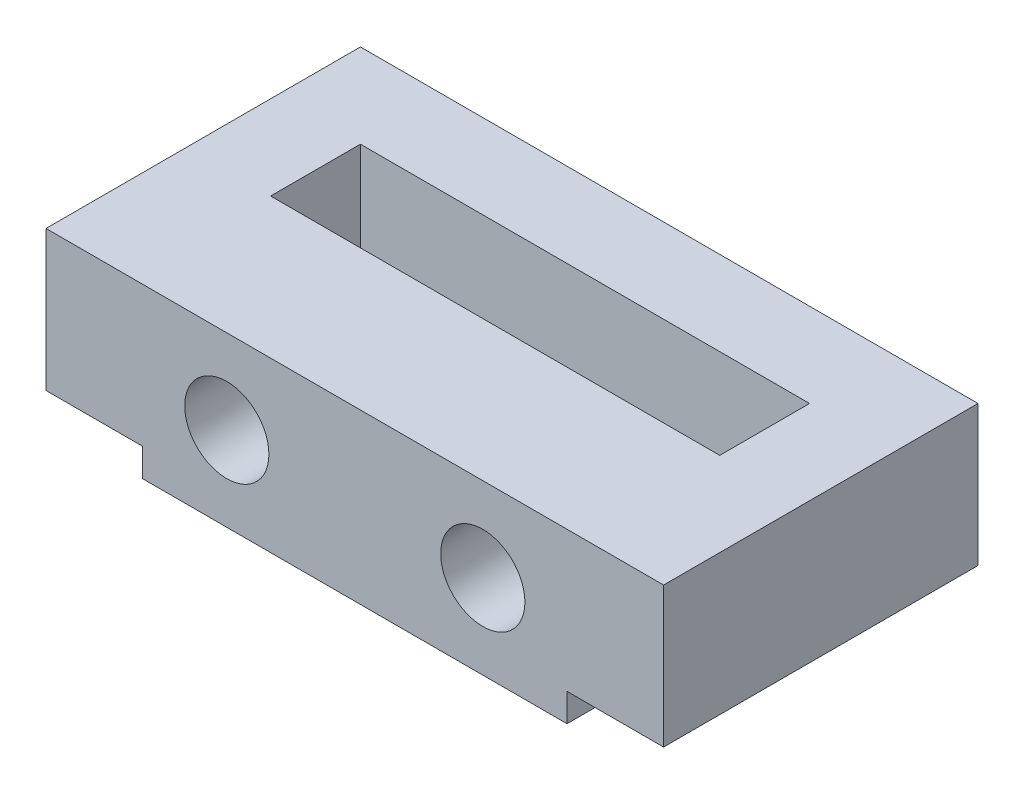
ISO-10303-21;
HEADER;
FILE_DESCRIPTION(('STEP AP214'),'2;1');
FILE_NAME('part.step','',(''),(''),'','','');
FILE_SCHEMA(('AUTOMOTIVE_DESIGN { 1 0 10303 214 1 1 1 1 }'));
ENDSEC;
DATA;
#1=APPLICATION_CONTEXT('core data for automotive mechanical design processes');
#2=APPLICATION_PROTOCOL_DEFINITION('international standard','automotive_design',2000,#1);
#3=PRODUCT_CONTEXT('',#1,'mechanical');
#4=PRODUCT('Part','Part','',(#3));
#5=PRODUCT_RELATED_PRODUCT_CATEGORY('part','',(#4));
#6=PRODUCT_DEFINITION_FORMATION('','',#4);
#7=PRODUCT_DEFINITION_CONTEXT('part definition',#1,'design');
#8=PRODUCT_DEFINITION('design','',#6,#7);
#9=PRODUCT_DEFINITION_SHAPE('','',#8);
#10=(LENGTH_UNIT() NAMED_UNIT(*) SI_UNIT(.MILLI.,.METRE.));
#11=(NAMED_UNIT(*) PLANE_ANGLE_UNIT() SI_UNIT($,.RADIAN.));
#12=(NAMED_UNIT(*) SI_UNIT($,.STERADIAN.) SOLID_ANGLE_UNIT());
#13=UNCERTAINTY_MEASURE_WITH_UNIT(LENGTH_MEASURE(1.E-05),#10,'distance_accuracy_value','');
#14=(GEOMETRIC_REPRESENTATION_CONTEXT(3) GLOBAL_UNCERTAINTY_ASSIGNED_CONTEXT((#13)) GLOBAL_UNIT_ASSIGNED_CONTEXT((#10,
#11,#12)) REPRESENTATION_CONTEXT('',''));
#15=CARTESIAN_POINT('',(0.,0.,0.));
#16=DIRECTION('',(0.,0.,1.));
#17=DIRECTION('',(1.,0.,0.));
#18=AXIS2_PLACEMENT_3D('',#15,#16,#17);
#19=CARTESIAN_POINT('',(0.,0.,5.));
#20=DIRECTION('',(0.,0.,1.));
#21=DIRECTION('',(1.,0.,0.));
#22=AXIS2_PLACEMENT_3D('',#19,#20,#21);
#23=PLANE('',#22);
#24=CARTESIAN_POINT('',(0.,0.,5.));
#25=DIRECTION('',(0.,0.,1.));
#26=DIRECTION('',(1.,0.,0.));
#27=AXIS2_PLACEMENT_3D('',#24,#25,#26);
#28=CIRCLE('',#27,1.5);
#29=CARTESIAN_POINT('',(1.5,0.,5.));
#30=VERTEX_POINT('',#29);
#31=EDGE_CURVE('E156',#30,#30,#28,.T.);
#32=ORIENTED_EDGE('',*,*,#31,.F.);
#33=EDGE_LOOP('',(#32));
#34=FACE_BOUND('',#33,.T.);
#35=DIRECTION('',(-1.,0.,0.));
#36=VECTOR('',#35,1.);
#37=CARTESIAN_POINT('',(-3.,3.,5.));
#38=LINE('',#37,#36);
#39=CARTESIAN_POINT('',(15.56,3.,5.));
#40=VERTEX_POINT('',#39);
#41=CARTESIAN_POINT('',(-6.44,3.,5.));
#42=VERTEX_POINT('',#41);
#43=EDGE_CURVE('E147',#40,#42,#38,.T.);
#44=ORIENTED_EDGE('',*,*,#43,.T.);
#45=DIRECTION('',(0.,1.,0.));
#46=VECTOR('',#45,1.);
#47=CARTESIAN_POINT('',(-6.44,-2.,5.));
#48=LINE('',#47,#46);
#49=CARTESIAN_POINT('',(-6.44,-2.,5.));
#50=VERTEX_POINT('',#49);
#51=EDGE_CURVE('E205',#50,#42,#48,.T.);
#52=ORIENTED_EDGE('',*,*,#51,.F.);
#53=DIRECTION('',(1.,0.,0.));
#54=VECTOR('',#53,1.);
#55=CARTESIAN_POINT('',(-6.44,-2.,5.));
#56=LINE('',#55,#54);
#57=CARTESIAN_POINT('',(-3.,-2.,5.));
#58=VERTEX_POINT('',#57);
#59=EDGE_CURVE('E222',#50,#58,#56,.T.);
#60=ORIENTED_EDGE('',*,*,#59,.T.);
#61=DIRECTION('',(0.,-1.,0.));
#62=VECTOR('',#61,1.);
#63=CARTESIAN_POINT('',(-3.,3.,5.));
#64=LINE('',#63,#62);
#65=CARTESIAN_POINT('',(-3.,-3.,5.));
#66=VERTEX_POINT('',#65);
#67=EDGE_CURVE('E48',#58,#66,#64,.T.);
#68=ORIENTED_EDGE('',*,*,#67,.T.);
#69=DIRECTION('',(1.,0.,0.));
#70=VECTOR('',#69,1.);
#71=CARTESIAN_POINT('',(-3.,-3.,5.));
#72=LINE('',#71,#70);
#73=CARTESIAN_POINT('',(12.12,-3.,5.));
#74=VERTEX_POINT('',#73);
#75=EDGE_CURVE('E145',#66,#74,#72,.T.);
#76=ORIENTED_EDGE('',*,*,#75,.T.);
#77=DIRECTION('',(0.,1.,0.));
#78=VECTOR('',#77,1.);
#79=CARTESIAN_POINT('',(12.12,3.,5.));
#80=LINE('',#79,#78);
#81=CARTESIAN_POINT('',(12.12,-2.,5.));
#82=VERTEX_POINT('',#81);
#83=EDGE_CURVE('E138',#74,#82,#80,.T.);
#84=ORIENTED_EDGE('',*,*,#83,.T.);
#85=DIRECTION('',(1.,0.,0.));
#86=VECTOR('',#85,1.);
#87=CARTESIAN_POINT('',(12.12,-2.,5.));
#88=LINE('',#87,#86);
#89=CARTESIAN_POINT('',(15.56,-2.,5.));
#90=VERTEX_POINT('',#89);
#91=EDGE_CURVE('E120',#82,#90,#88,.T.);
#92=ORIENTED_EDGE('',*,*,#91,.T.);
#93=DIRECTION('',(0.,1.,0.));
#94=VECTOR('',#93,1.);
#95=CARTESIAN_POINT('',(15.56,-2.,5.));
#96=LINE('',#95,#94);
#97=EDGE_CURVE('E170',#90,#40,#96,.T.);
#98=ORIENTED_EDGE('',*,*,#97,.T.);
#99=EDGE_LOOP('',(#44,#52,#60,#68,#76,#84,#92,#98));
#100=FACE_BOUND('',#99,.T.);
#101=CARTESIAN_POINT('',(9.12,0.,5.));
#102=DIRECTION('',(0.,0.,1.));
#103=DIRECTION('',(1.,0.,0.));
#104=AXIS2_PLACEMENT_3D('',#101,#102,#103);
#105=CIRCLE('',#104,1.5);
#106=CARTESIAN_POINT('',(10.62,0.,5.));
#107=VERTEX_POINT('',#106);
#108=EDGE_CURVE('E211',#107,#107,#105,.T.);
#109=ORIENTED_EDGE('',*,*,#108,.F.);
#110=EDGE_LOOP('',(#109));
#111=FACE_BOUND('',#110,.T.);
#112=ADVANCED_FACE('F33',(#34,#100,#111),#23,.T.);
#113=CARTESIAN_POINT('',(0.,0.,0.));
#114=DIRECTION('',(0.,0.,1.));
#115=DIRECTION('',(1.,0.,0.));
#116=AXIS2_PLACEMENT_3D('',#113,#114,#115);
#117=PLANE('',#116);
#118=DIRECTION('',(0.,-1.,0.));
#119=VECTOR('',#118,1.);
#120=CARTESIAN_POINT('',(-3.,3.,0.));
#121=LINE('',#120,#119);
#122=CARTESIAN_POINT('',(-3.,-2.,0.));
#123=VERTEX_POINT('',#122);
#124=CARTESIAN_POINT('',(-3.,-3.,0.));
#125=VERTEX_POINT('',#124);
#126=EDGE_CURVE('E153',#123,#125,#121,.T.);
#127=ORIENTED_EDGE('',*,*,#126,.F.);
#128=DIRECTION('',(-1.,0.,0.));
#129=VECTOR('',#128,1.);
#130=CARTESIAN_POINT('',(-3.44,-2.,0.));
#131=LINE('',#130,#129);
#132=CARTESIAN_POINT('',(-3.44,-2.,0.));
#133=VERTEX_POINT('',#132);
#134=EDGE_CURVE('E226',#123,#133,#131,.T.);
#135=ORIENTED_EDGE('',*,*,#134,.T.);
#136=DIRECTION('',(0.,1.,0.));
#137=VECTOR('',#136,1.);
#138=CARTESIAN_POINT('',(-3.44,-2.,0.));
#139=LINE('',#138,#137);
#140=CARTESIAN_POINT('',(-3.44,3.,0.));
#141=VERTEX_POINT('',#140);
#142=EDGE_CURVE('E202',#133,#141,#139,.T.);
#143=ORIENTED_EDGE('',*,*,#142,.T.);
#144=DIRECTION('',(-1.,0.,0.));
#145=VECTOR('',#144,1.);
#146=CARTESIAN_POINT('',(-3.,3.,0.));
#147=LINE('',#146,#145);
#148=CARTESIAN_POINT('',(12.56,3.,0.));
#149=VERTEX_POINT('',#148);
#150=EDGE_CURVE('E159',#149,#141,#147,.T.);
#151=ORIENTED_EDGE('',*,*,#150,.F.);
#152=DIRECTION('',(0.,1.,0.));
#153=VECTOR('',#152,1.);
#154=CARTESIAN_POINT('',(12.56,-2.,0.));
#155=LINE('',#154,#153);
#156=CARTESIAN_POINT('',(12.56,-2.,0.));
#157=VERTEX_POINT('',#156);
#158=EDGE_CURVE('E167',#157,#149,#155,.T.);
#159=ORIENTED_EDGE('',*,*,#158,.F.);
#160=DIRECTION('',(-1.,0.,0.));
#161=VECTOR('',#160,1.);
#162=CARTESIAN_POINT('',(12.12,-2.,0.));
#163=LINE('',#162,#161);
#164=CARTESIAN_POINT('',(12.12,-2.,0.));
#165=VERTEX_POINT('',#164);
#166=EDGE_CURVE('E165',#157,#165,#163,.T.);
#167=ORIENTED_EDGE('',*,*,#166,.T.);
#168=DIRECTION('',(0.,1.,0.));
#169=VECTOR('',#168,1.);
#170=CARTESIAN_POINT('',(12.12,3.,0.));
#171=LINE('',#170,#169);
#172=CARTESIAN_POINT('',(12.12,-3.,0.));
#173=VERTEX_POINT('',#172);
#174=EDGE_CURVE('E140',#173,#165,#171,.T.);
#175=ORIENTED_EDGE('',*,*,#174,.F.);
#176=DIRECTION('',(1.,0.,0.));
#177=VECTOR('',#176,1.);
#178=CARTESIAN_POINT('',(-3.,-3.,0.));
#179=LINE('',#178,#177);
#180=EDGE_CURVE('E155',#125,#173,#179,.T.);
#181=ORIENTED_EDGE('',*,*,#180,.F.);
#182=EDGE_LOOP('',(#127,#135,#143,#151,#159,#167,#175,#181));
#183=FACE_BOUND('',#182,.T.);
#184=CARTESIAN_POINT('',(0.,0.,0.));
#185=DIRECTION('',(0.,0.,1.));
#186=DIRECTION('',(1.,0.,0.));
#187=AXIS2_PLACEMENT_3D('',#184,#185,#186);
#188=CIRCLE('',#187,1.5);
#189=CARTESIAN_POINT('',(1.5,0.,0.));
#190=VERTEX_POINT('',#189);
#191=EDGE_CURVE('E214',#190,#190,#188,.T.);
#192=ORIENTED_EDGE('',*,*,#191,.T.);
#193=EDGE_LOOP('',(#192));
#194=FACE_BOUND('',#193,.T.);
#195=CARTESIAN_POINT('',(9.12,0.,0.));
#196=DIRECTION('',(0.,0.,1.));
#197=DIRECTION('',(1.,0.,0.));
#198=AXIS2_PLACEMENT_3D('',#195,#196,#197);
#199=CIRCLE('',#198,1.5);
#200=CARTESIAN_POINT('',(10.62,0.,0.));
#201=VERTEX_POINT('',#200);
#202=EDGE_CURVE('E197',#201,#201,#199,.T.);
#203=ORIENTED_EDGE('',*,*,#202,.T.);
#204=EDGE_LOOP('',(#203));
#205=FACE_BOUND('',#204,.T.);
#206=ADVANCED_FACE('F163',(#183,#194,#205),#117,.F.);
#207=CARTESIAN_POINT('',(-3.,3.,5.));
#208=DIRECTION('',(1.,0.,0.));
#209=DIRECTION('',(0.,0.,-1.));
#210=AXIS2_PLACEMENT_3D('',#207,#208,#209);
#211=PLANE('',#210);
#212=ORIENTED_EDGE('',*,*,#67,.F.);
#213=DIRECTION('',(0.,0.,-1.));
#214=VECTOR('',#213,1.);
#215=CARTESIAN_POINT('',(-3.,-2.,5.));
#216=LINE('',#215,#214);
#217=EDGE_CURVE('E52',#58,#123,#216,.T.);
#218=ORIENTED_EDGE('',*,*,#217,.T.);
#219=ORIENTED_EDGE('',*,*,#126,.T.);
#220=DIRECTION('',(0.,0.,-1.));
#221=VECTOR('',#220,1.);
#222=CARTESIAN_POINT('',(-3.,-3.,5.));
#223=LINE('',#222,#221);
#224=EDGE_CURVE('E11',#66,#125,#223,.T.);
#225=ORIENTED_EDGE('',*,*,#224,.F.);
#226=EDGE_LOOP('',(#212,#218,#219,#225));
#227=FACE_BOUND('',#226,.T.);
#228=ADVANCED_FACE('F35',(#227),#211,.F.);
#229=CARTESIAN_POINT('',(-3.,-3.,5.));
#230=DIRECTION('',(0.,1.,0.));
#231=DIRECTION('',(-1.,0.,0.));
#232=AXIS2_PLACEMENT_3D('',#229,#230,#231);
#233=PLANE('',#232);
#234=ORIENTED_EDGE('',*,*,#180,.T.);
#235=DIRECTION('',(0.,0.,-1.));
#236=VECTOR('',#235,1.);
#237=CARTESIAN_POINT('',(12.12,-3.,5.));
#238=LINE('',#237,#236);
#239=EDGE_CURVE('E41',#74,#173,#238,.T.);
#240=ORIENTED_EDGE('',*,*,#239,.F.);
#241=ORIENTED_EDGE('',*,*,#75,.F.);
#242=ORIENTED_EDGE('',*,*,#224,.T.);
#243=EDGE_LOOP('',(#234,#240,#241,#242));
#244=FACE_BOUND('',#243,.T.);
#245=ADVANCED_FACE('F223',(#244),#233,.F.);
#246=CARTESIAN_POINT('',(12.12,3.,5.));
#247=DIRECTION('',(-1.,0.,0.));
#248=DIRECTION('',(0.,0.,1.));
#249=AXIS2_PLACEMENT_3D('',#246,#247,#248);
#250=PLANE('',#249);
#251=ORIENTED_EDGE('',*,*,#174,.T.);
#252=DIRECTION('',(0.,0.,1.));
#253=VECTOR('',#252,1.);
#254=CARTESIAN_POINT('',(12.12,-2.,5.));
#255=LINE('',#254,#253);
#256=EDGE_CURVE('E124',#165,#82,#255,.T.);
#257=ORIENTED_EDGE('',*,*,#256,.T.);
#258=ORIENTED_EDGE('',*,*,#83,.F.);
#259=ORIENTED_EDGE('',*,*,#239,.T.);
#260=EDGE_LOOP('',(#251,#257,#258,#259));
#261=FACE_BOUND('',#260,.T.);
#262=ADVANCED_FACE('F136',(#261),#250,.F.);
#263=CARTESIAN_POINT('',(-3.,3.,5.));
#264=DIRECTION('',(0.,-1.,0.));
#265=DIRECTION('',(1.,0.,0.));
#266=AXIS2_PLACEMENT_3D('',#263,#264,#265);
#267=PLANE('',#266);
#268=DIRECTION('',(0.,0.,1.));
#269=VECTOR('',#268,1.);
#270=CARTESIAN_POINT('',(12.56,3.,0.));
#271=LINE('',#270,#269);
#272=CARTESIAN_POINT('',(12.56,3.,-3.2));
#273=VERTEX_POINT('',#272);
#274=EDGE_CURVE('E141',#273,#149,#271,.T.);
#275=ORIENTED_EDGE('',*,*,#274,.T.);
#276=ORIENTED_EDGE('',*,*,#150,.T.);
#277=DIRECTION('',(0.,0.,-1.));
#278=VECTOR('',#277,1.);
#279=CARTESIAN_POINT('',(-3.44,3.,-3.2));
#280=LINE('',#279,#278);
#281=CARTESIAN_POINT('',(-3.44,3.,-3.2));
#282=VERTEX_POINT('',#281);
#283=EDGE_CURVE('E188',#141,#282,#280,.T.);
#284=ORIENTED_EDGE('',*,*,#283,.T.);
#285=DIRECTION('',(1.,0.,0.));
#286=VECTOR('',#285,1.);
#287=CARTESIAN_POINT('',(12.56,3.,-3.2));
#288=LINE('',#287,#286);
#289=EDGE_CURVE('E191',#282,#273,#288,.T.);
#290=ORIENTED_EDGE('',*,*,#289,.T.);
#291=EDGE_LOOP('',(#275,#276,#284,#290));
#292=FACE_BOUND('',#291,.T.);
#293=ORIENTED_EDGE('',*,*,#43,.F.);
#294=DIRECTION('',(0.,0.,-1.));
#295=VECTOR('',#294,1.);
#296=CARTESIAN_POINT('',(15.56,3.,5.));
#297=LINE('',#296,#295);
#298=CARTESIAN_POINT('',(15.56,3.,-6.2));
#299=VERTEX_POINT('',#298);
#300=EDGE_CURVE('E179',#40,#299,#297,.T.);
#301=ORIENTED_EDGE('',*,*,#300,.T.);
#302=DIRECTION('',(-1.,0.,0.));
#303=VECTOR('',#302,1.);
#304=CARTESIAN_POINT('',(15.56,3.,-6.2));
#305=LINE('',#304,#303);
#306=CARTESIAN_POINT('',(-6.44,3.,-6.2));
#307=VERTEX_POINT('',#306);
#308=EDGE_CURVE('E182',#299,#307,#305,.T.);
#309=ORIENTED_EDGE('',*,*,#308,.T.);
#310=DIRECTION('',(0.,0.,1.));
#311=VECTOR('',#310,1.);
#312=CARTESIAN_POINT('',(-6.44,3.,-6.2));
#313=LINE('',#312,#311);
#314=EDGE_CURVE('E185',#307,#42,#313,.T.);
#315=ORIENTED_EDGE('',*,*,#314,.T.);
#316=EDGE_LOOP('',(#293,#301,#309,#315));
#317=FACE_BOUND('',#316,.T.);
#318=ADVANCED_FACE('F246',(#292,#317),#267,.F.);
#319=CARTESIAN_POINT('',(0.,0.,5.));
#320=DIRECTION('',(0.,0.,-1.));
#321=DIRECTION('',(-1.,0.,0.));
#322=AXIS2_PLACEMENT_3D('',#319,#320,#321);
#323=CYLINDRICAL_SURFACE('',#322,1.5);
#324=ORIENTED_EDGE('',*,*,#31,.T.);
#325=EDGE_LOOP('',(#324));
#326=FACE_BOUND('',#325,.T.);
#327=ORIENTED_EDGE('',*,*,#191,.F.);
#328=EDGE_LOOP('',(#327));
#329=FACE_BOUND('',#328,.T.);
#330=ADVANCED_FACE('F249',(#326,#329),#323,.F.);
#331=CARTESIAN_POINT('',(9.12,0.,5.));
#332=DIRECTION('',(0.,0.,-1.));
#333=DIRECTION('',(-1.,0.,0.));
#334=AXIS2_PLACEMENT_3D('',#331,#332,#333);
#335=CYLINDRICAL_SURFACE('',#334,1.5);
#336=ORIENTED_EDGE('',*,*,#108,.T.);
#337=EDGE_LOOP('',(#336));
#338=FACE_BOUND('',#337,.T.);
#339=ORIENTED_EDGE('',*,*,#202,.F.);
#340=EDGE_LOOP('',(#339));
#341=FACE_BOUND('',#340,.T.);
#342=ADVANCED_FACE('F317',(#338,#341),#335,.F.);
#343=CARTESIAN_POINT('',(12.56,-2.,0.));
#344=DIRECTION('',(-1.,0.,0.));
#345=DIRECTION('',(0.,0.,1.));
#346=AXIS2_PLACEMENT_3D('',#343,#344,#345);
#347=PLANE('',#346);
#348=ORIENTED_EDGE('',*,*,#274,.F.);
#349=DIRECTION('',(0.,1.,0.));
#350=VECTOR('',#349,1.);
#351=CARTESIAN_POINT('',(12.56,-2.,-3.2));
#352=LINE('',#351,#350);
#353=CARTESIAN_POINT('',(12.56,-2.,-3.2));
#354=VERTEX_POINT('',#353);
#355=EDGE_CURVE('E198',#354,#273,#352,.T.);
#356=ORIENTED_EDGE('',*,*,#355,.F.);
#357=DIRECTION('',(0.,0.,1.));
#358=VECTOR('',#357,1.);
#359=CARTESIAN_POINT('',(12.56,-2.,0.));
#360=LINE('',#359,#358);
#361=EDGE_CURVE('E171',#354,#157,#360,.T.);
#362=ORIENTED_EDGE('',*,*,#361,.T.);
#363=ORIENTED_EDGE('',*,*,#158,.T.);
#364=EDGE_LOOP('',(#348,#356,#362,#363));
#365=FACE_BOUND('',#364,.T.);
#366=ADVANCED_FACE('F245',(#365),#347,.T.);
#367=CARTESIAN_POINT('',(12.56,-2.,-3.2));
#368=DIRECTION('',(0.,0.,1.));
#369=DIRECTION('',(1.,0.,0.));
#370=AXIS2_PLACEMENT_3D('',#367,#368,#369);
#371=PLANE('',#370);
#372=ORIENTED_EDGE('',*,*,#289,.F.);
#373=DIRECTION('',(0.,1.,0.));
#374=VECTOR('',#373,1.);
#375=CARTESIAN_POINT('',(-3.44,-2.,-3.2));
#376=LINE('',#375,#374);
#377=CARTESIAN_POINT('',(-3.44,-2.,-3.2));
#378=VERTEX_POINT('',#377);
#379=EDGE_CURVE('E200',#378,#282,#376,.T.);
#380=ORIENTED_EDGE('',*,*,#379,.F.);
#381=DIRECTION('',(1.,0.,0.));
#382=VECTOR('',#381,1.);
#383=CARTESIAN_POINT('',(12.56,-2.,-3.2));
#384=LINE('',#383,#382);
#385=EDGE_CURVE('E175',#378,#354,#384,.T.);
#386=ORIENTED_EDGE('',*,*,#385,.T.);
#387=ORIENTED_EDGE('',*,*,#355,.T.);
#388=EDGE_LOOP('',(#372,#380,#386,#387));
#389=FACE_BOUND('',#388,.T.);
#390=ADVANCED_FACE('F238',(#389),#371,.T.);
#391=CARTESIAN_POINT('',(-3.44,-2.,-3.2));
#392=DIRECTION('',(1.,0.,0.));
#393=DIRECTION('',(0.,0.,-1.));
#394=AXIS2_PLACEMENT_3D('',#391,#392,#393);
#395=PLANE('',#394);
#396=ORIENTED_EDGE('',*,*,#283,.F.);
#397=ORIENTED_EDGE('',*,*,#142,.F.);
#398=DIRECTION('',(0.,0.,-1.));
#399=VECTOR('',#398,1.);
#400=CARTESIAN_POINT('',(-3.44,-2.,-3.2));
#401=LINE('',#400,#399);
#402=EDGE_CURVE('E230',#133,#378,#401,.T.);
#403=ORIENTED_EDGE('',*,*,#402,.T.);
#404=ORIENTED_EDGE('',*,*,#379,.T.);
#405=EDGE_LOOP('',(#396,#397,#403,#404));
#406=FACE_BOUND('',#405,.T.);
#407=ADVANCED_FACE('F242',(#406),#395,.T.);
#408=CARTESIAN_POINT('',(-6.44,-2.,-6.2));
#409=DIRECTION('',(-1.,0.,0.));
#410=DIRECTION('',(0.,-1.,0.));
#411=AXIS2_PLACEMENT_3D('',#408,#409,#410);
#412=PLANE('',#411);
#413=ORIENTED_EDGE('',*,*,#314,.F.);
#414=DIRECTION('',(0.,1.,0.));
#415=VECTOR('',#414,1.);
#416=CARTESIAN_POINT('',(-6.44,-2.,-6.2));
#417=LINE('',#416,#415);
#418=CARTESIAN_POINT('',(-6.44,-2.,-6.2));
#419=VERTEX_POINT('',#418);
#420=EDGE_CURVE('E208',#419,#307,#417,.T.);
#421=ORIENTED_EDGE('',*,*,#420,.F.);
#422=DIRECTION('',(0.,0.,1.));
#423=VECTOR('',#422,1.);
#424=CARTESIAN_POINT('',(-6.44,-2.,-6.2));
#425=LINE('',#424,#423);
#426=EDGE_CURVE('E264',#419,#50,#425,.T.);
#427=ORIENTED_EDGE('',*,*,#426,.T.);
#428=ORIENTED_EDGE('',*,*,#51,.T.);
#429=EDGE_LOOP('',(#413,#421,#427,#428));
#430=FACE_BOUND('',#429,.T.);
#431=ADVANCED_FACE('F263',(#430),#412,.T.);
#432=CARTESIAN_POINT('',(15.56,-2.,-6.2));
#433=DIRECTION('',(0.,0.,-1.));
#434=DIRECTION('',(-1.,0.,0.));
#435=AXIS2_PLACEMENT_3D('',#432,#433,#434);
#436=PLANE('',#435);
#437=ORIENTED_EDGE('',*,*,#308,.F.);
#438=DIRECTION('',(0.,1.,0.));
#439=VECTOR('',#438,1.);
#440=CARTESIAN_POINT('',(15.56,-2.,-6.2));
#441=LINE('',#440,#439);
#442=CARTESIAN_POINT('',(15.56,-2.,-6.2));
#443=VERTEX_POINT('',#442);
#444=EDGE_CURVE('E173',#443,#299,#441,.T.);
#445=ORIENTED_EDGE('',*,*,#444,.F.);
#446=DIRECTION('',(-1.,0.,0.));
#447=VECTOR('',#446,1.);
#448=CARTESIAN_POINT('',(15.56,-2.,-6.2));
#449=LINE('',#448,#447);
#450=EDGE_CURVE('E259',#443,#419,#449,.T.);
#451=ORIENTED_EDGE('',*,*,#450,.T.);
#452=ORIENTED_EDGE('',*,*,#420,.T.);
#453=EDGE_LOOP('',(#437,#445,#451,#452));
#454=FACE_BOUND('',#453,.T.);
#455=ADVANCED_FACE('F258',(#454),#436,.T.);
#456=CARTESIAN_POINT('',(15.56,-2.,5.));
#457=DIRECTION('',(1.,0.,0.));
#458=DIRECTION('',(0.,1.,0.));
#459=AXIS2_PLACEMENT_3D('',#456,#457,#458);
#460=PLANE('',#459);
#461=ORIENTED_EDGE('',*,*,#300,.F.);
#462=ORIENTED_EDGE('',*,*,#97,.F.);
#463=DIRECTION('',(0.,0.,-1.));
#464=VECTOR('',#463,1.);
#465=CARTESIAN_POINT('',(15.56,-2.,5.));
#466=LINE('',#465,#464);
#467=EDGE_CURVE('E128',#90,#443,#466,.T.);
#468=ORIENTED_EDGE('',*,*,#467,.T.);
#469=ORIENTED_EDGE('',*,*,#444,.T.);
#470=EDGE_LOOP('',(#461,#462,#468,#469));
#471=FACE_BOUND('',#470,.T.);
#472=ADVANCED_FACE('F254',(#471),#460,.T.);
#473=CARTESIAN_POINT('',(0.,-2.,0.));
#474=DIRECTION('',(0.,-1.,0.));
#475=DIRECTION('',(0.,0.,-1.));
#476=AXIS2_PLACEMENT_3D('',#473,#474,#475);
#477=PLANE('',#476);
#478=ORIENTED_EDGE('',*,*,#256,.F.);
#479=ORIENTED_EDGE('',*,*,#166,.F.);
#480=ORIENTED_EDGE('',*,*,#361,.F.);
#481=ORIENTED_EDGE('',*,*,#385,.F.);
#482=ORIENTED_EDGE('',*,*,#402,.F.);
#483=ORIENTED_EDGE('',*,*,#134,.F.);
#484=ORIENTED_EDGE('',*,*,#217,.F.);
#485=ORIENTED_EDGE('',*,*,#59,.F.);
#486=ORIENTED_EDGE('',*,*,#426,.F.);
#487=ORIENTED_EDGE('',*,*,#450,.F.);
#488=ORIENTED_EDGE('',*,*,#467,.F.);
#489=ORIENTED_EDGE('',*,*,#91,.F.);
#490=EDGE_LOOP('',(#478,#479,#480,#481,#482,#483,#484,#485,#486,#487,#488,#489));
#491=FACE_BOUND('',#490,.T.);
#492=ADVANCED_FACE('F122',(#491),#477,.T.);
#493=CLOSED_SHELL('',(#112,#206,#228,#245,#262,#318,#330,#342,#366,#390,#407,#431,#455,#472,#492));
#494=MANIFOLD_SOLID_BREP('B2',#493);
#495=ADVANCED_BREP_SHAPE_REPRESENTATION('',(#18,#494),#14);
#496=SHAPE_DEFINITION_REPRESENTATION(#9,#495);
ENDSEC;
END-ISO-10303-21;
